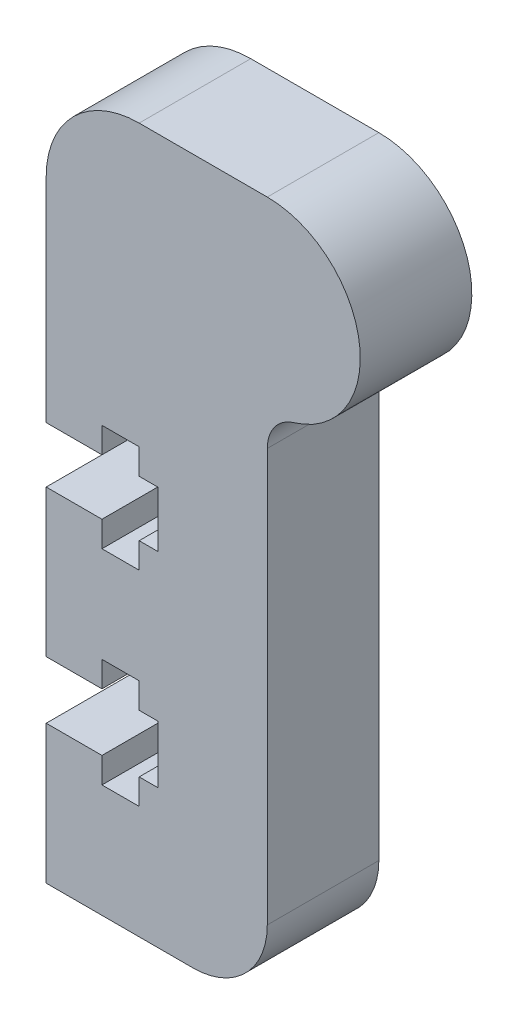
ISO-10303-21;
HEADER;
FILE_DESCRIPTION(('STEP AP214'),'2;1');
FILE_NAME('part.step','',(''),(''),'','','');
FILE_SCHEMA(('AUTOMOTIVE_DESIGN { 1 0 10303 214 1 1 1 1 }'));
ENDSEC;
DATA;
#1=APPLICATION_CONTEXT('core data for automotive mechanical design processes');
#2=APPLICATION_PROTOCOL_DEFINITION('international standard','automotive_design',2000,#1);
#3=PRODUCT_CONTEXT('',#1,'mechanical');
#4=PRODUCT('Part','Part','',(#3));
#5=PRODUCT_RELATED_PRODUCT_CATEGORY('part','',(#4));
#6=PRODUCT_DEFINITION_FORMATION('','',#4);
#7=PRODUCT_DEFINITION_CONTEXT('part definition',#1,'design');
#8=PRODUCT_DEFINITION('design','',#6,#7);
#9=PRODUCT_DEFINITION_SHAPE('','',#8);
#10=(LENGTH_UNIT() NAMED_UNIT(*) SI_UNIT(.MILLI.,.METRE.));
#11=(NAMED_UNIT(*) PLANE_ANGLE_UNIT() SI_UNIT($,.RADIAN.));
#12=(NAMED_UNIT(*) SI_UNIT($,.STERADIAN.) SOLID_ANGLE_UNIT());
#13=UNCERTAINTY_MEASURE_WITH_UNIT(LENGTH_MEASURE(1.E-05),#10,'distance_accuracy_value','');
#14=(GEOMETRIC_REPRESENTATION_CONTEXT(3) GLOBAL_UNCERTAINTY_ASSIGNED_CONTEXT((#13)) GLOBAL_UNIT_ASSIGNED_CONTEXT((#10,
#11,#12)) REPRESENTATION_CONTEXT('',''));
#15=CARTESIAN_POINT('',(0.,0.,0.));
#16=DIRECTION('',(0.,0.,1.));
#17=DIRECTION('',(1.,0.,0.));
#18=AXIS2_PLACEMENT_3D('',#15,#16,#17);
#19=CARTESIAN_POINT('',(5.00000000000291,61.8720955981045,-6.));
#20=DIRECTION('',(0.,1.,0.));
#21=DIRECTION('',(0.,0.,1.));
#22=AXIS2_PLACEMENT_3D('',#19,#20,#21);
#23=PLANE('',#22);
#24=DIRECTION('',(-1.,0.,0.));
#25=VECTOR('',#24,1.);
#26=CARTESIAN_POINT('',(5.00000000000291,61.8720955981045,0.));
#27=LINE('',#26,#25);
#28=CARTESIAN_POINT('',(5.00000000000291,61.8720955981045,0.));
#29=VERTEX_POINT('',#28);
#30=CARTESIAN_POINT('',(3.00000000000291,61.8720955981045,0.));
#31=VERTEX_POINT('',#30);
#32=EDGE_CURVE('E276',#29,#31,#27,.T.);
#33=ORIENTED_EDGE('',*,*,#32,.F.);
#34=DIRECTION('',(0.,0.,1.));
#35=VECTOR('',#34,1.);
#36=CARTESIAN_POINT('',(5.00000000000291,61.8720955981045,-6.));
#37=LINE('',#36,#35);
#38=CARTESIAN_POINT('',(5.00000000000291,61.8720955981045,-6.));
#39=VERTEX_POINT('',#38);
#40=EDGE_CURVE('E11',#39,#29,#37,.T.);
#41=ORIENTED_EDGE('',*,*,#40,.F.);
#42=DIRECTION('',(-1.,0.,0.));
#43=VECTOR('',#42,1.);
#44=CARTESIAN_POINT('',(5.00000000000291,61.8720955981045,-6.));
#45=LINE('',#44,#43);
#46=CARTESIAN_POINT('',(3.00000000000291,61.8720955981045,-6.));
#47=VERTEX_POINT('',#46);
#48=EDGE_CURVE('E368',#39,#47,#45,.T.);
#49=ORIENTED_EDGE('',*,*,#48,.T.);
#50=DIRECTION('',(0.,0.,1.));
#51=VECTOR('',#50,1.);
#52=CARTESIAN_POINT('',(3.00000000000291,61.8720955981045,-6.));
#53=LINE('',#52,#51);
#54=EDGE_CURVE('E38',#47,#31,#53,.T.);
#55=ORIENTED_EDGE('',*,*,#54,.T.);
#56=EDGE_LOOP('',(#33,#41,#49,#55));
#57=FACE_BOUND('',#56,.T.);
#58=ADVANCED_FACE('F35',(#57),#23,.T.);
#59=CARTESIAN_POINT('',(5.00000000000291,63.2470955981045,-6.));
#60=DIRECTION('',(-1.,0.,0.));
#61=DIRECTION('',(0.,0.,1.));
#62=AXIS2_PLACEMENT_3D('',#59,#60,#61);
#63=PLANE('',#62);
#64=DIRECTION('',(0.,-1.,0.));
#65=VECTOR('',#64,1.);
#66=CARTESIAN_POINT('',(5.00000000000291,63.2470955981045,0.));
#67=LINE('',#66,#65);
#68=CARTESIAN_POINT('',(5.00000000000291,63.2470955981045,0.));
#69=VERTEX_POINT('',#68);
#70=EDGE_CURVE('E366',#69,#29,#67,.T.);
#71=ORIENTED_EDGE('',*,*,#70,.F.);
#72=DIRECTION('',(0.,0.,1.));
#73=VECTOR('',#72,1.);
#74=CARTESIAN_POINT('',(5.00000000000291,63.2470955981045,-6.));
#75=LINE('',#74,#73);
#76=CARTESIAN_POINT('',(5.00000000000291,63.2470955981045,-6.));
#77=VERTEX_POINT('',#76);
#78=EDGE_CURVE('E44',#77,#69,#75,.T.);
#79=ORIENTED_EDGE('',*,*,#78,.F.);
#80=DIRECTION('',(0.,-1.,0.));
#81=VECTOR('',#80,1.);
#82=CARTESIAN_POINT('',(5.00000000000291,63.2470955981045,-6.));
#83=LINE('',#82,#81);
#84=EDGE_CURVE('E266',#77,#39,#83,.T.);
#85=ORIENTED_EDGE('',*,*,#84,.T.);
#86=ORIENTED_EDGE('',*,*,#40,.T.);
#87=EDGE_LOOP('',(#71,#79,#85,#86));
#88=FACE_BOUND('',#87,.T.);
#89=ADVANCED_FACE('F428',(#88),#63,.T.);
#90=CARTESIAN_POINT('',(6.00000000000291,63.2470955981045,-6.));
#91=DIRECTION('',(0.,1.,0.));
#92=DIRECTION('',(0.,0.,1.));
#93=AXIS2_PLACEMENT_3D('',#90,#91,#92);
#94=PLANE('',#93);
#95=DIRECTION('',(-1.,0.,0.));
#96=VECTOR('',#95,1.);
#97=CARTESIAN_POINT('',(6.00000000000291,63.2470955981045,0.));
#98=LINE('',#97,#96);
#99=CARTESIAN_POINT('',(6.00000000000291,63.2470955981045,0.));
#100=VERTEX_POINT('',#99);
#101=EDGE_CURVE('E253',#100,#69,#98,.T.);
#102=ORIENTED_EDGE('',*,*,#101,.F.);
#103=DIRECTION('',(0.,0.,1.));
#104=VECTOR('',#103,1.);
#105=CARTESIAN_POINT('',(6.00000000000291,63.2470955981045,-6.));
#106=LINE('',#105,#104);
#107=CARTESIAN_POINT('',(6.00000000000291,63.2470955981045,-6.));
#108=VERTEX_POINT('',#107);
#109=EDGE_CURVE('E248',#108,#100,#106,.T.);
#110=ORIENTED_EDGE('',*,*,#109,.F.);
#111=DIRECTION('',(-1.,0.,0.));
#112=VECTOR('',#111,1.);
#113=CARTESIAN_POINT('',(6.00000000000291,63.2470955981045,-6.));
#114=LINE('',#113,#112);
#115=EDGE_CURVE('E251',#108,#77,#114,.T.);
#116=ORIENTED_EDGE('',*,*,#115,.T.);
#117=ORIENTED_EDGE('',*,*,#78,.T.);
#118=EDGE_LOOP('',(#102,#110,#116,#117));
#119=FACE_BOUND('',#118,.T.);
#120=ADVANCED_FACE('F250',(#119),#94,.T.);
#121=CARTESIAN_POINT('',(6.00000000000291,66.3470955981045,-6.));
#122=DIRECTION('',(-1.,0.,0.));
#123=DIRECTION('',(0.,-1.,0.));
#124=AXIS2_PLACEMENT_3D('',#121,#122,#123);
#125=PLANE('',#124);
#126=DIRECTION('',(0.,-1.,0.));
#127=VECTOR('',#126,1.);
#128=CARTESIAN_POINT('',(6.00000000000291,66.3470955981045,0.));
#129=LINE('',#128,#127);
#130=CARTESIAN_POINT('',(6.00000000000291,66.3470955981045,0.));
#131=VERTEX_POINT('',#130);
#132=EDGE_CURVE('E363',#131,#100,#129,.T.);
#133=ORIENTED_EDGE('',*,*,#132,.F.);
#134=DIRECTION('',(0.,0.,1.));
#135=VECTOR('',#134,1.);
#136=CARTESIAN_POINT('',(6.00000000000291,66.3470955981045,-6.));
#137=LINE('',#136,#135);
#138=CARTESIAN_POINT('',(6.00000000000291,66.3470955981045,-6.));
#139=VERTEX_POINT('',#138);
#140=EDGE_CURVE('E258',#139,#131,#137,.T.);
#141=ORIENTED_EDGE('',*,*,#140,.F.);
#142=DIRECTION('',(0.,-1.,0.));
#143=VECTOR('',#142,1.);
#144=CARTESIAN_POINT('',(6.00000000000291,66.3470955981045,-6.));
#145=LINE('',#144,#143);
#146=EDGE_CURVE('E264',#139,#108,#145,.T.);
#147=ORIENTED_EDGE('',*,*,#146,.T.);
#148=ORIENTED_EDGE('',*,*,#109,.T.);
#149=EDGE_LOOP('',(#133,#141,#147,#148));
#150=FACE_BOUND('',#149,.T.);
#151=ADVANCED_FACE('F268',(#150),#125,.T.);
#152=CARTESIAN_POINT('',(5.00000000000291,66.3470955981045,-6.));
#153=DIRECTION('',(0.,-1.,0.));
#154=DIRECTION('',(0.,0.,-1.));
#155=AXIS2_PLACEMENT_3D('',#152,#153,#154);
#156=PLANE('',#155);
#157=DIRECTION('',(1.,0.,0.));
#158=VECTOR('',#157,1.);
#159=CARTESIAN_POINT('',(5.00000000000291,66.3470955981045,0.));
#160=LINE('',#159,#158);
#161=CARTESIAN_POINT('',(5.00000000000291,66.3470955981045,0.));
#162=VERTEX_POINT('',#161);
#163=EDGE_CURVE('E360',#162,#131,#160,.T.);
#164=ORIENTED_EDGE('',*,*,#163,.F.);
#165=DIRECTION('',(0.,0.,1.));
#166=VECTOR('',#165,1.);
#167=CARTESIAN_POINT('',(5.00000000000291,66.3470955981045,-6.));
#168=LINE('',#167,#166);
#169=CARTESIAN_POINT('',(5.00000000000291,66.3470955981045,-6.));
#170=VERTEX_POINT('',#169);
#171=EDGE_CURVE('E372',#170,#162,#168,.T.);
#172=ORIENTED_EDGE('',*,*,#171,.F.);
#173=DIRECTION('',(1.,0.,0.));
#174=VECTOR('',#173,1.);
#175=CARTESIAN_POINT('',(5.00000000000291,66.3470955981045,-6.));
#176=LINE('',#175,#174);
#177=EDGE_CURVE('E269',#170,#139,#176,.T.);
#178=ORIENTED_EDGE('',*,*,#177,.T.);
#179=ORIENTED_EDGE('',*,*,#140,.T.);
#180=EDGE_LOOP('',(#164,#172,#178,#179));
#181=FACE_BOUND('',#180,.T.);
#182=ADVANCED_FACE('F441',(#181),#156,.T.);
#183=CARTESIAN_POINT('',(5.00000000000291,67.7220955981045,-6.));
#184=DIRECTION('',(-1.,0.,0.));
#185=DIRECTION('',(0.,-1.,0.));
#186=AXIS2_PLACEMENT_3D('',#183,#184,#185);
#187=PLANE('',#186);
#188=DIRECTION('',(0.,-1.,0.));
#189=VECTOR('',#188,1.);
#190=CARTESIAN_POINT('',(5.00000000000291,67.7220955981045,0.));
#191=LINE('',#190,#189);
#192=CARTESIAN_POINT('',(5.00000000000291,67.7220955981045,0.));
#193=VERTEX_POINT('',#192);
#194=EDGE_CURVE('E357',#193,#162,#191,.T.);
#195=ORIENTED_EDGE('',*,*,#194,.F.);
#196=DIRECTION('',(0.,0.,1.));
#197=VECTOR('',#196,1.);
#198=CARTESIAN_POINT('',(5.00000000000291,67.7220955981045,-6.));
#199=LINE('',#198,#197);
#200=CARTESIAN_POINT('',(5.00000000000291,67.7220955981045,-6.));
#201=VERTEX_POINT('',#200);
#202=EDGE_CURVE('E374',#201,#193,#199,.T.);
#203=ORIENTED_EDGE('',*,*,#202,.F.);
#204=DIRECTION('',(0.,-1.,0.));
#205=VECTOR('',#204,1.);
#206=CARTESIAN_POINT('',(5.00000000000291,67.7220955981045,-6.));
#207=LINE('',#206,#205);
#208=EDGE_CURVE('E271',#201,#170,#207,.T.);
#209=ORIENTED_EDGE('',*,*,#208,.T.);
#210=ORIENTED_EDGE('',*,*,#171,.T.);
#211=EDGE_LOOP('',(#195,#203,#209,#210));
#212=FACE_BOUND('',#211,.T.);
#213=ADVANCED_FACE('F444',(#212),#187,.T.);
#214=CARTESIAN_POINT('',(3.00000000000291,67.7220955981045,-6.));
#215=DIRECTION('',(0.,-1.,0.));
#216=DIRECTION('',(0.,0.,-1.));
#217=AXIS2_PLACEMENT_3D('',#214,#215,#216);
#218=PLANE('',#217);
#219=DIRECTION('',(1.,0.,0.));
#220=VECTOR('',#219,1.);
#221=CARTESIAN_POINT('',(3.00000000000291,67.7220955981045,0.));
#222=LINE('',#221,#220);
#223=CARTESIAN_POINT('',(3.00000000000291,67.7220955981045,0.));
#224=VERTEX_POINT('',#223);
#225=EDGE_CURVE('E354',#224,#193,#222,.T.);
#226=ORIENTED_EDGE('',*,*,#225,.F.);
#227=DIRECTION('',(0.,0.,1.));
#228=VECTOR('',#227,1.);
#229=CARTESIAN_POINT('',(3.00000000000291,67.7220955981045,-6.));
#230=LINE('',#229,#228);
#231=CARTESIAN_POINT('',(3.00000000000291,67.7220955981045,-6.));
#232=VERTEX_POINT('',#231);
#233=EDGE_CURVE('E376',#232,#224,#230,.T.);
#234=ORIENTED_EDGE('',*,*,#233,.F.);
#235=DIRECTION('',(1.,0.,0.));
#236=VECTOR('',#235,1.);
#237=CARTESIAN_POINT('',(3.00000000000291,67.7220955981045,-6.));
#238=LINE('',#237,#236);
#239=EDGE_CURVE('E847',#232,#201,#238,.T.);
#240=ORIENTED_EDGE('',*,*,#239,.T.);
#241=ORIENTED_EDGE('',*,*,#202,.T.);
#242=EDGE_LOOP('',(#226,#234,#240,#241));
#243=FACE_BOUND('',#242,.T.);
#244=ADVANCED_FACE('F448',(#243),#218,.T.);
#245=CARTESIAN_POINT('',(3.00000000000291,66.3470955981045,-6.));
#246=DIRECTION('',(1.,0.,0.));
#247=DIRECTION('',(0.,1.,0.));
#248=AXIS2_PLACEMENT_3D('',#245,#246,#247);
#249=PLANE('',#248);
#250=DIRECTION('',(0.,1.,0.));
#251=VECTOR('',#250,1.);
#252=CARTESIAN_POINT('',(3.00000000000291,66.3470955981045,0.));
#253=LINE('',#252,#251);
#254=CARTESIAN_POINT('',(3.00000000000291,66.3470955981045,0.));
#255=VERTEX_POINT('',#254);
#256=EDGE_CURVE('E351',#255,#224,#253,.T.);
#257=ORIENTED_EDGE('',*,*,#256,.F.);
#258=DIRECTION('',(0.,0.,1.));
#259=VECTOR('',#258,1.);
#260=CARTESIAN_POINT('',(3.00000000000291,66.3470955981045,-6.));
#261=LINE('',#260,#259);
#262=CARTESIAN_POINT('',(3.00000000000291,66.3470955981045,-6.));
#263=VERTEX_POINT('',#262);
#264=EDGE_CURVE('E378',#263,#255,#261,.T.);
#265=ORIENTED_EDGE('',*,*,#264,.F.);
#266=DIRECTION('',(0.,1.,0.));
#267=VECTOR('',#266,1.);
#268=CARTESIAN_POINT('',(3.00000000000291,66.3470955981045,-6.));
#269=LINE('',#268,#267);
#270=EDGE_CURVE('E840',#263,#232,#269,.T.);
#271=ORIENTED_EDGE('',*,*,#270,.T.);
#272=ORIENTED_EDGE('',*,*,#233,.T.);
#273=EDGE_LOOP('',(#257,#265,#271,#272));
#274=FACE_BOUND('',#273,.T.);
#275=ADVANCED_FACE('F452',(#274),#249,.T.);
#276=CARTESIAN_POINT('',(2.9108938047519E-12,66.3470955981045,-6.));
#277=DIRECTION('',(0.,-1.,0.));
#278=DIRECTION('',(0.,0.,-1.));
#279=AXIS2_PLACEMENT_3D('',#276,#277,#278);
#280=PLANE('',#279);
#281=DIRECTION('',(1.,0.,0.));
#282=VECTOR('',#281,1.);
#283=CARTESIAN_POINT('',(2.9108938047519E-12,66.3470955981045,0.));
#284=LINE('',#283,#282);
#285=CARTESIAN_POINT('',(2.9108938047519E-12,66.3470955981045,0.));
#286=VERTEX_POINT('',#285);
#287=EDGE_CURVE('E348',#286,#255,#284,.T.);
#288=ORIENTED_EDGE('',*,*,#287,.F.);
#289=DIRECTION('',(0.,0.,1.));
#290=VECTOR('',#289,1.);
#291=CARTESIAN_POINT('',(2.9108938047519E-12,66.3470955981045,-6.));
#292=LINE('',#291,#290);
#293=CARTESIAN_POINT('',(2.9108938047519E-12,66.3470955981045,-6.));
#294=VERTEX_POINT('',#293);
#295=EDGE_CURVE('E380',#294,#286,#292,.T.);
#296=ORIENTED_EDGE('',*,*,#295,.F.);
#297=DIRECTION('',(1.,0.,0.));
#298=VECTOR('',#297,1.);
#299=CARTESIAN_POINT('',(2.9108938047519E-12,66.3470955981045,-6.));
#300=LINE('',#299,#298);
#301=EDGE_CURVE('E836',#294,#263,#300,.T.);
#302=ORIENTED_EDGE('',*,*,#301,.T.);
#303=ORIENTED_EDGE('',*,*,#264,.T.);
#304=EDGE_LOOP('',(#288,#296,#302,#303));
#305=FACE_BOUND('',#304,.T.);
#306=ADVANCED_FACE('F456',(#305),#280,.T.);
#307=CARTESIAN_POINT('',(2.90799139183792E-12,74.2470955981045,-6.));
#308=DIRECTION('',(-1.,0.,0.));
#309=DIRECTION('',(0.,-1.,0.));
#310=AXIS2_PLACEMENT_3D('',#307,#308,#309);
#311=PLANE('',#310);
#312=DIRECTION('',(0.,-1.,0.));
#313=VECTOR('',#312,1.);
#314=CARTESIAN_POINT('',(2.90799139183792E-12,74.2470955981045,0.));
#315=LINE('',#314,#313);
#316=CARTESIAN_POINT('',(2.90799139183792E-12,74.2470955981045,0.));
#317=VERTEX_POINT('',#316);
#318=EDGE_CURVE('E345',#317,#286,#315,.T.);
#319=ORIENTED_EDGE('',*,*,#318,.F.);
#320=DIRECTION('',(0.,0.,1.));
#321=VECTOR('',#320,1.);
#322=CARTESIAN_POINT('',(2.90799139183792E-12,74.2470955981045,-6.));
#323=LINE('',#322,#321);
#324=CARTESIAN_POINT('',(2.90799139183792E-12,74.2470955981045,-6.));
#325=VERTEX_POINT('',#324);
#326=EDGE_CURVE('E382',#325,#317,#323,.T.);
#327=ORIENTED_EDGE('',*,*,#326,.F.);
#328=DIRECTION('',(0.,-1.,0.));
#329=VECTOR('',#328,1.);
#330=CARTESIAN_POINT('',(2.90799139183792E-12,74.2470955981045,-6.));
#331=LINE('',#330,#329);
#332=EDGE_CURVE('E852',#325,#294,#331,.T.);
#333=ORIENTED_EDGE('',*,*,#332,.T.);
#334=ORIENTED_EDGE('',*,*,#295,.T.);
#335=EDGE_LOOP('',(#319,#327,#333,#334));
#336=FACE_BOUND('',#335,.T.);
#337=ADVANCED_FACE('F460',(#336),#311,.T.);
#338=CARTESIAN_POINT('',(3.00000000000122,74.2470955981045,-6.));
#339=DIRECTION('',(0.,1.,0.));
#340=DIRECTION('',(0.,0.,1.));
#341=AXIS2_PLACEMENT_3D('',#338,#339,#340);
#342=PLANE('',#341);
#343=DIRECTION('',(-1.,0.,0.));
#344=VECTOR('',#343,1.);
#345=CARTESIAN_POINT('',(3.00000000000122,74.2470955981045,0.));
#346=LINE('',#345,#344);
#347=CARTESIAN_POINT('',(3.00000000000122,74.2470955981045,0.));
#348=VERTEX_POINT('',#347);
#349=EDGE_CURVE('E342',#348,#317,#346,.T.);
#350=ORIENTED_EDGE('',*,*,#349,.F.);
#351=DIRECTION('',(0.,0.,1.));
#352=VECTOR('',#351,1.);
#353=CARTESIAN_POINT('',(3.00000000000122,74.2470955981045,-6.));
#354=LINE('',#353,#352);
#355=CARTESIAN_POINT('',(3.00000000000122,74.2470955981045,-6.));
#356=VERTEX_POINT('',#355);
#357=EDGE_CURVE('E384',#356,#348,#354,.T.);
#358=ORIENTED_EDGE('',*,*,#357,.F.);
#359=DIRECTION('',(-1.,0.,0.));
#360=VECTOR('',#359,1.);
#361=CARTESIAN_POINT('',(3.00000000000122,74.2470955981045,-6.));
#362=LINE('',#361,#360);
#363=EDGE_CURVE('E829',#356,#325,#362,.T.);
#364=ORIENTED_EDGE('',*,*,#363,.T.);
#365=ORIENTED_EDGE('',*,*,#326,.T.);
#366=EDGE_LOOP('',(#350,#358,#364,#365));
#367=FACE_BOUND('',#366,.T.);
#368=ADVANCED_FACE('F464',(#367),#342,.T.);
#369=CARTESIAN_POINT('',(3.00000000000122,72.8720955981045,-6.));
#370=DIRECTION('',(1.,0.,0.));
#371=DIRECTION('',(0.,1.,0.));
#372=AXIS2_PLACEMENT_3D('',#369,#370,#371);
#373=PLANE('',#372);
#374=DIRECTION('',(0.,1.,0.));
#375=VECTOR('',#374,1.);
#376=CARTESIAN_POINT('',(3.00000000000122,72.8720955981045,0.));
#377=LINE('',#376,#375);
#378=CARTESIAN_POINT('',(3.00000000000122,72.8720955981045,0.));
#379=VERTEX_POINT('',#378);
#380=EDGE_CURVE('E339',#379,#348,#377,.T.);
#381=ORIENTED_EDGE('',*,*,#380,.F.);
#382=DIRECTION('',(0.,0.,1.));
#383=VECTOR('',#382,1.);
#384=CARTESIAN_POINT('',(3.00000000000122,72.8720955981045,-6.));
#385=LINE('',#384,#383);
#386=CARTESIAN_POINT('',(3.00000000000122,72.8720955981045,-6.));
#387=VERTEX_POINT('',#386);
#388=EDGE_CURVE('E386',#387,#379,#385,.T.);
#389=ORIENTED_EDGE('',*,*,#388,.F.);
#390=DIRECTION('',(0.,1.,0.));
#391=VECTOR('',#390,1.);
#392=CARTESIAN_POINT('',(3.00000000000122,72.8720955981045,-6.));
#393=LINE('',#392,#391);
#394=EDGE_CURVE('E825',#387,#356,#393,.T.);
#395=ORIENTED_EDGE('',*,*,#394,.T.);
#396=ORIENTED_EDGE('',*,*,#357,.T.);
#397=EDGE_LOOP('',(#381,#389,#395,#396));
#398=FACE_BOUND('',#397,.T.);
#399=ADVANCED_FACE('F468',(#398),#373,.T.);
#400=CARTESIAN_POINT('',(5.00000000000122,72.8720955981045,-6.));
#401=DIRECTION('',(0.,1.,0.));
#402=DIRECTION('',(0.,0.,1.));
#403=AXIS2_PLACEMENT_3D('',#400,#401,#402);
#404=PLANE('',#403);
#405=DIRECTION('',(-1.,0.,0.));
#406=VECTOR('',#405,1.);
#407=CARTESIAN_POINT('',(5.00000000000122,72.8720955981045,0.));
#408=LINE('',#407,#406);
#409=CARTESIAN_POINT('',(5.00000000000122,72.8720955981045,0.));
#410=VERTEX_POINT('',#409);
#411=EDGE_CURVE('E336',#410,#379,#408,.T.);
#412=ORIENTED_EDGE('',*,*,#411,.F.);
#413=DIRECTION('',(0.,0.,1.));
#414=VECTOR('',#413,1.);
#415=CARTESIAN_POINT('',(5.00000000000122,72.8720955981045,-6.));
#416=LINE('',#415,#414);
#417=CARTESIAN_POINT('',(5.00000000000122,72.8720955981045,-6.));
#418=VERTEX_POINT('',#417);
#419=EDGE_CURVE('E388',#418,#410,#416,.T.);
#420=ORIENTED_EDGE('',*,*,#419,.F.);
#421=DIRECTION('',(-1.,0.,0.));
#422=VECTOR('',#421,1.);
#423=CARTESIAN_POINT('',(5.00000000000122,72.8720955981045,-6.));
#424=LINE('',#423,#422);
#425=EDGE_CURVE('E856',#418,#387,#424,.T.);
#426=ORIENTED_EDGE('',*,*,#425,.T.);
#427=ORIENTED_EDGE('',*,*,#388,.T.);
#428=EDGE_LOOP('',(#412,#420,#426,#427));
#429=FACE_BOUND('',#428,.T.);
#430=ADVANCED_FACE('F472',(#429),#404,.T.);
#431=CARTESIAN_POINT('',(5.00000000000122,74.2470955981045,-6.));
#432=DIRECTION('',(-1.,0.,0.));
#433=DIRECTION('',(0.,0.,1.));
#434=AXIS2_PLACEMENT_3D('',#431,#432,#433);
#435=PLANE('',#434);
#436=DIRECTION('',(0.,-1.,0.));
#437=VECTOR('',#436,1.);
#438=CARTESIAN_POINT('',(5.00000000000122,74.2470955981045,0.));
#439=LINE('',#438,#437);
#440=CARTESIAN_POINT('',(5.00000000000122,74.2470955981045,0.));
#441=VERTEX_POINT('',#440);
#442=EDGE_CURVE('E333',#441,#410,#439,.T.);
#443=ORIENTED_EDGE('',*,*,#442,.F.);
#444=DIRECTION('',(0.,0.,1.));
#445=VECTOR('',#444,1.);
#446=CARTESIAN_POINT('',(5.00000000000122,74.2470955981045,-6.));
#447=LINE('',#446,#445);
#448=CARTESIAN_POINT('',(5.00000000000122,74.2470955981045,-6.));
#449=VERTEX_POINT('',#448);
#450=EDGE_CURVE('E390',#449,#441,#447,.T.);
#451=ORIENTED_EDGE('',*,*,#450,.F.);
#452=DIRECTION('',(0.,-1.,0.));
#453=VECTOR('',#452,1.);
#454=CARTESIAN_POINT('',(5.00000000000122,74.2470955981045,-6.));
#455=LINE('',#454,#453);
#456=EDGE_CURVE('E818',#449,#418,#455,.T.);
#457=ORIENTED_EDGE('',*,*,#456,.T.);
#458=ORIENTED_EDGE('',*,*,#419,.T.);
#459=EDGE_LOOP('',(#443,#451,#457,#458));
#460=FACE_BOUND('',#459,.T.);
#461=ADVANCED_FACE('F476',(#460),#435,.T.);
#462=CARTESIAN_POINT('',(6.00000000000122,74.2470955981045,-6.));
#463=DIRECTION('',(0.,1.,0.));
#464=DIRECTION('',(0.,0.,1.));
#465=AXIS2_PLACEMENT_3D('',#462,#463,#464);
#466=PLANE('',#465);
#467=DIRECTION('',(-1.,0.,0.));
#468=VECTOR('',#467,1.);
#469=CARTESIAN_POINT('',(6.00000000000122,74.2470955981045,0.));
#470=LINE('',#469,#468);
#471=CARTESIAN_POINT('',(6.00000000000122,74.2470955981045,0.));
#472=VERTEX_POINT('',#471);
#473=EDGE_CURVE('E330',#472,#441,#470,.T.);
#474=ORIENTED_EDGE('',*,*,#473,.F.);
#475=DIRECTION('',(0.,0.,1.));
#476=VECTOR('',#475,1.);
#477=CARTESIAN_POINT('',(6.00000000000122,74.2470955981045,-6.));
#478=LINE('',#477,#476);
#479=CARTESIAN_POINT('',(6.00000000000122,74.2470955981045,-6.));
#480=VERTEX_POINT('',#479);
#481=EDGE_CURVE('E392',#480,#472,#478,.T.);
#482=ORIENTED_EDGE('',*,*,#481,.F.);
#483=DIRECTION('',(-1.,0.,0.));
#484=VECTOR('',#483,1.);
#485=CARTESIAN_POINT('',(6.00000000000122,74.2470955981045,-6.));
#486=LINE('',#485,#484);
#487=EDGE_CURVE('E814',#480,#449,#486,.T.);
#488=ORIENTED_EDGE('',*,*,#487,.T.);
#489=ORIENTED_EDGE('',*,*,#450,.T.);
#490=EDGE_LOOP('',(#474,#482,#488,#489));
#491=FACE_BOUND('',#490,.T.);
#492=ADVANCED_FACE('F480',(#491),#466,.T.);
#493=CARTESIAN_POINT('',(6.00000000000121,77.2454923882621,-6.));
#494=DIRECTION('',(-1.,0.,0.));
#495=DIRECTION('',(0.,-1.,0.));
#496=AXIS2_PLACEMENT_3D('',#493,#494,#495);
#497=PLANE('',#496);
#498=DIRECTION('',(0.,-1.,0.));
#499=VECTOR('',#498,1.);
#500=CARTESIAN_POINT('',(6.00000000000121,77.2454923882621,0.));
#501=LINE('',#500,#499);
#502=CARTESIAN_POINT('',(6.00000000000121,77.2454923882621,0.));
#503=VERTEX_POINT('',#502);
#504=EDGE_CURVE('E327',#503,#472,#501,.T.);
#505=ORIENTED_EDGE('',*,*,#504,.F.);
#506=DIRECTION('',(0.,0.,1.));
#507=VECTOR('',#506,1.);
#508=CARTESIAN_POINT('',(6.00000000000121,77.2454923882621,-6.));
#509=LINE('',#508,#507);
#510=CARTESIAN_POINT('',(6.00000000000121,77.2454923882621,-6.));
#511=VERTEX_POINT('',#510);
#512=EDGE_CURVE('E394',#511,#503,#509,.T.);
#513=ORIENTED_EDGE('',*,*,#512,.F.);
#514=DIRECTION('',(0.,-1.,0.));
#515=VECTOR('',#514,1.);
#516=CARTESIAN_POINT('',(6.00000000000121,77.2454923882621,-6.));
#517=LINE('',#516,#515);
#518=EDGE_CURVE('E860',#511,#480,#517,.T.);
#519=ORIENTED_EDGE('',*,*,#518,.T.);
#520=ORIENTED_EDGE('',*,*,#481,.T.);
#521=EDGE_LOOP('',(#505,#513,#519,#520));
#522=FACE_BOUND('',#521,.T.);
#523=ADVANCED_FACE('F484',(#522),#497,.T.);
#524=CARTESIAN_POINT('',(5.00000000000121,77.2454923882621,-6.));
#525=DIRECTION('',(0.,-1.,0.));
#526=DIRECTION('',(0.,0.,-1.));
#527=AXIS2_PLACEMENT_3D('',#524,#525,#526);
#528=PLANE('',#527);
#529=DIRECTION('',(1.,0.,0.));
#530=VECTOR('',#529,1.);
#531=CARTESIAN_POINT('',(5.00000000000121,77.2454923882621,0.));
#532=LINE('',#531,#530);
#533=CARTESIAN_POINT('',(5.00000000000121,77.2454923882621,0.));
#534=VERTEX_POINT('',#533);
#535=EDGE_CURVE('E324',#534,#503,#532,.T.);
#536=ORIENTED_EDGE('',*,*,#535,.F.);
#537=DIRECTION('',(0.,0.,1.));
#538=VECTOR('',#537,1.);
#539=CARTESIAN_POINT('',(5.00000000000121,77.2454923882621,-6.));
#540=LINE('',#539,#538);
#541=CARTESIAN_POINT('',(5.00000000000121,77.2454923882621,-6.));
#542=VERTEX_POINT('',#541);
#543=EDGE_CURVE('E396',#542,#534,#540,.T.);
#544=ORIENTED_EDGE('',*,*,#543,.F.);
#545=DIRECTION('',(1.,0.,0.));
#546=VECTOR('',#545,1.);
#547=CARTESIAN_POINT('',(5.00000000000121,77.2454923882621,-6.));
#548=LINE('',#547,#546);
#549=EDGE_CURVE('E807',#542,#511,#548,.T.);
#550=ORIENTED_EDGE('',*,*,#549,.T.);
#551=ORIENTED_EDGE('',*,*,#512,.T.);
#552=EDGE_LOOP('',(#536,#544,#550,#551));
#553=FACE_BOUND('',#552,.T.);
#554=ADVANCED_FACE('F488',(#553),#528,.T.);
#555=CARTESIAN_POINT('',(5.00000000000121,78.6204923882621,-6.));
#556=DIRECTION('',(-1.,0.,0.));
#557=DIRECTION('',(0.,0.,1.));
#558=AXIS2_PLACEMENT_3D('',#555,#556,#557);
#559=PLANE('',#558);
#560=DIRECTION('',(0.,-1.,0.));
#561=VECTOR('',#560,1.);
#562=CARTESIAN_POINT('',(5.00000000000121,78.6204923882621,0.));
#563=LINE('',#562,#561);
#564=CARTESIAN_POINT('',(5.00000000000121,78.6204923882621,0.));
#565=VERTEX_POINT('',#564);
#566=EDGE_CURVE('E321',#565,#534,#563,.T.);
#567=ORIENTED_EDGE('',*,*,#566,.F.);
#568=DIRECTION('',(0.,0.,1.));
#569=VECTOR('',#568,1.);
#570=CARTESIAN_POINT('',(5.00000000000121,78.6204923882621,-6.));
#571=LINE('',#570,#569);
#572=CARTESIAN_POINT('',(5.00000000000121,78.6204923882621,-6.));
#573=VERTEX_POINT('',#572);
#574=EDGE_CURVE('E398',#573,#565,#571,.T.);
#575=ORIENTED_EDGE('',*,*,#574,.F.);
#576=DIRECTION('',(0.,-1.,0.));
#577=VECTOR('',#576,1.);
#578=CARTESIAN_POINT('',(5.00000000000121,78.6204923882621,-6.));
#579=LINE('',#578,#577);
#580=EDGE_CURVE('E803',#573,#542,#579,.T.);
#581=ORIENTED_EDGE('',*,*,#580,.T.);
#582=ORIENTED_EDGE('',*,*,#543,.T.);
#583=EDGE_LOOP('',(#567,#575,#581,#582));
#584=FACE_BOUND('',#583,.T.);
#585=ADVANCED_FACE('F492',(#584),#559,.T.);
#586=CARTESIAN_POINT('',(3.00000000000121,78.6204923882621,-6.));
#587=DIRECTION('',(0.,-1.,0.));
#588=DIRECTION('',(0.,0.,-1.));
#589=AXIS2_PLACEMENT_3D('',#586,#587,#588);
#590=PLANE('',#589);
#591=DIRECTION('',(1.,0.,0.));
#592=VECTOR('',#591,1.);
#593=CARTESIAN_POINT('',(3.00000000000121,78.6204923882621,0.));
#594=LINE('',#593,#592);
#595=CARTESIAN_POINT('',(3.00000000000121,78.6204923882621,0.));
#596=VERTEX_POINT('',#595);
#597=EDGE_CURVE('E318',#596,#565,#594,.T.);
#598=ORIENTED_EDGE('',*,*,#597,.F.);
#599=DIRECTION('',(0.,0.,1.));
#600=VECTOR('',#599,1.);
#601=CARTESIAN_POINT('',(3.00000000000121,78.6204923882621,-6.));
#602=LINE('',#601,#600);
#603=CARTESIAN_POINT('',(3.00000000000121,78.6204923882621,-6.));
#604=VERTEX_POINT('',#603);
#605=EDGE_CURVE('E400',#604,#596,#602,.T.);
#606=ORIENTED_EDGE('',*,*,#605,.F.);
#607=DIRECTION('',(1.,0.,0.));
#608=VECTOR('',#607,1.);
#609=CARTESIAN_POINT('',(3.00000000000121,78.6204923882621,-6.));
#610=LINE('',#609,#608);
#611=EDGE_CURVE('E864',#604,#573,#610,.T.);
#612=ORIENTED_EDGE('',*,*,#611,.T.);
#613=ORIENTED_EDGE('',*,*,#574,.T.);
#614=EDGE_LOOP('',(#598,#606,#612,#613));
#615=FACE_BOUND('',#614,.T.);
#616=ADVANCED_FACE('F496',(#615),#590,.T.);
#617=CARTESIAN_POINT('',(3.00000000000121,77.2454923882621,-6.));
#618=DIRECTION('',(1.,0.,0.));
#619=DIRECTION('',(0.,0.,-1.));
#620=AXIS2_PLACEMENT_3D('',#617,#618,#619);
#621=PLANE('',#620);
#622=DIRECTION('',(0.,1.,0.));
#623=VECTOR('',#622,1.);
#624=CARTESIAN_POINT('',(3.00000000000121,77.2454923882621,0.));
#625=LINE('',#624,#623);
#626=CARTESIAN_POINT('',(3.00000000000121,77.2454923882621,0.));
#627=VERTEX_POINT('',#626);
#628=EDGE_CURVE('E315',#627,#596,#625,.T.);
#629=ORIENTED_EDGE('',*,*,#628,.F.);
#630=DIRECTION('',(0.,0.,1.));
#631=VECTOR('',#630,1.);
#632=CARTESIAN_POINT('',(3.00000000000121,77.2454923882621,-6.));
#633=LINE('',#632,#631);
#634=CARTESIAN_POINT('',(3.00000000000121,77.2454923882621,-6.));
#635=VERTEX_POINT('',#634);
#636=EDGE_CURVE('E402',#635,#627,#633,.T.);
#637=ORIENTED_EDGE('',*,*,#636,.F.);
#638=DIRECTION('',(0.,1.,0.));
#639=VECTOR('',#638,1.);
#640=CARTESIAN_POINT('',(3.00000000000121,77.2454923882621,-6.));
#641=LINE('',#640,#639);
#642=EDGE_CURVE('E796',#635,#604,#641,.T.);
#643=ORIENTED_EDGE('',*,*,#642,.T.);
#644=ORIENTED_EDGE('',*,*,#605,.T.);
#645=EDGE_LOOP('',(#629,#637,#643,#644));
#646=FACE_BOUND('',#645,.T.);
#647=ADVANCED_FACE('F500',(#646),#621,.T.);
#648=CARTESIAN_POINT('',(0.,77.2454923882621,-6.));
#649=DIRECTION('',(0.,-1.,0.));
#650=DIRECTION('',(0.,0.,-1.));
#651=AXIS2_PLACEMENT_3D('',#648,#649,#650);
#652=PLANE('',#651);
#653=DIRECTION('',(1.,0.,0.));
#654=VECTOR('',#653,1.);
#655=CARTESIAN_POINT('',(0.,77.2454923882621,0.));
#656=LINE('',#655,#654);
#657=CARTESIAN_POINT('',(0.,77.2454923882621,0.));
#658=VERTEX_POINT('',#657);
#659=EDGE_CURVE('E312',#658,#627,#656,.T.);
#660=ORIENTED_EDGE('',*,*,#659,.F.);
#661=DIRECTION('',(0.,0.,1.));
#662=VECTOR('',#661,1.);
#663=CARTESIAN_POINT('',(0.,77.2454923882621,-6.));
#664=LINE('',#663,#662);
#665=CARTESIAN_POINT('',(0.,77.2454923882621,-6.));
#666=VERTEX_POINT('',#665);
#667=EDGE_CURVE('E404',#666,#658,#664,.T.);
#668=ORIENTED_EDGE('',*,*,#667,.F.);
#669=DIRECTION('',(1.,0.,0.));
#670=VECTOR('',#669,1.);
#671=CARTESIAN_POINT('',(0.,77.2454923882621,-6.));
#672=LINE('',#671,#670);
#673=EDGE_CURVE('E792',#666,#635,#672,.T.);
#674=ORIENTED_EDGE('',*,*,#673,.T.);
#675=ORIENTED_EDGE('',*,*,#636,.T.);
#676=EDGE_LOOP('',(#660,#668,#674,#675));
#677=FACE_BOUND('',#676,.T.);
#678=ADVANCED_FACE('F504',(#677),#652,.T.);
#679=CARTESIAN_POINT('',(0.,88.6954923882617,-6.));
#680=DIRECTION('',(-1.,0.,0.));
#681=DIRECTION('',(0.,0.,1.));
#682=AXIS2_PLACEMENT_3D('',#679,#680,#681);
#683=PLANE('',#682);
#684=DIRECTION('',(0.,-1.,0.));
#685=VECTOR('',#684,1.);
#686=CARTESIAN_POINT('',(0.,88.6954923882617,0.));
#687=LINE('',#686,#685);
#688=CARTESIAN_POINT('',(0.,88.6954923882617,0.));
#689=VERTEX_POINT('',#688);
#690=EDGE_CURVE('E309',#689,#658,#687,.T.);
#691=ORIENTED_EDGE('',*,*,#690,.F.);
#692=DIRECTION('',(0.,0.,1.));
#693=VECTOR('',#692,1.);
#694=CARTESIAN_POINT('',(0.,88.6954923882617,-6.));
#695=LINE('',#694,#693);
#696=CARTESIAN_POINT('',(0.,88.6954923882617,-6.));
#697=VERTEX_POINT('',#696);
#698=EDGE_CURVE('E406',#697,#689,#695,.T.);
#699=ORIENTED_EDGE('',*,*,#698,.F.);
#700=DIRECTION('',(0.,-1.,0.));
#701=VECTOR('',#700,1.);
#702=CARTESIAN_POINT('',(0.,88.6954923882617,-6.));
#703=LINE('',#702,#701);
#704=EDGE_CURVE('E868',#697,#666,#703,.T.);
#705=ORIENTED_EDGE('',*,*,#704,.T.);
#706=ORIENTED_EDGE('',*,*,#667,.T.);
#707=EDGE_LOOP('',(#691,#699,#705,#706));
#708=FACE_BOUND('',#707,.T.);
#709=ADVANCED_FACE('F508',(#708),#683,.T.);
#710=CARTESIAN_POINT('',(5.,88.6954923882617,-6.));
#711=DIRECTION('',(0.,0.,1.));
#712=DIRECTION('',(1.,0.,0.));
#713=AXIS2_PLACEMENT_3D('',#710,#711,#712);
#714=CYLINDRICAL_SURFACE('',#713,5.);
#715=CARTESIAN_POINT('',(5.,88.6954923882617,0.));
#716=DIRECTION('',(0.,0.,1.));
#717=DIRECTION('',(1.,0.,0.));
#718=AXIS2_PLACEMENT_3D('',#715,#716,#717);
#719=CIRCLE('',#718,5.);
#720=CARTESIAN_POINT('',(5.00000000000004,93.6954923882617,0.));
#721=VERTEX_POINT('',#720);
#722=EDGE_CURVE('E306',#721,#689,#719,.T.);
#723=ORIENTED_EDGE('',*,*,#722,.F.);
#724=DIRECTION('',(0.,0.,1.));
#725=VECTOR('',#724,1.);
#726=CARTESIAN_POINT('',(5.00000000000004,93.6954923882617,-6.));
#727=LINE('',#726,#725);
#728=CARTESIAN_POINT('',(5.00000000000004,93.6954923882617,-6.));
#729=VERTEX_POINT('',#728);
#730=EDGE_CURVE('E408',#729,#721,#727,.T.);
#731=ORIENTED_EDGE('',*,*,#730,.F.);
#732=CARTESIAN_POINT('',(5.,88.6954923882617,-6.));
#733=DIRECTION('',(0.,0.,1.));
#734=DIRECTION('',(1.,0.,0.));
#735=AXIS2_PLACEMENT_3D('',#732,#733,#734);
#736=CIRCLE('',#735,5.);
#737=EDGE_CURVE('E785',#729,#697,#736,.T.);
#738=ORIENTED_EDGE('',*,*,#737,.T.);
#739=ORIENTED_EDGE('',*,*,#698,.T.);
#740=EDGE_LOOP('',(#723,#731,#738,#739));
#741=FACE_BOUND('',#740,.T.);
#742=ADVANCED_FACE('F512',(#741),#714,.T.);
#743=CARTESIAN_POINT('',(5.00000000000004,93.6954923882617,-6.));
#744=DIRECTION('',(0.,1.,0.));
#745=DIRECTION('',(0.,0.,1.));
#746=AXIS2_PLACEMENT_3D('',#743,#744,#745);
#747=PLANE('',#746);
#748=DIRECTION('',(-1.,0.,0.));
#749=VECTOR('',#748,1.);
#750=CARTESIAN_POINT('',(5.00000000000004,93.6954923882617,0.));
#751=LINE('',#750,#749);
#752=CARTESIAN_POINT('',(11.8893076230229,93.6954923882617,0.));
#753=VERTEX_POINT('',#752);
#754=EDGE_CURVE('E303',#753,#721,#751,.T.);
#755=ORIENTED_EDGE('',*,*,#754,.F.);
#756=DIRECTION('',(0.,0.,1.));
#757=VECTOR('',#756,1.);
#758=CARTESIAN_POINT('',(11.8893076230229,93.6954923882617,-6.));
#759=LINE('',#758,#757);
#760=CARTESIAN_POINT('',(11.8893076230229,93.6954923882617,-6.));
#761=VERTEX_POINT('',#760);
#762=EDGE_CURVE('E410',#761,#753,#759,.T.);
#763=ORIENTED_EDGE('',*,*,#762,.F.);
#764=DIRECTION('',(-1.,0.,0.));
#765=VECTOR('',#764,1.);
#766=CARTESIAN_POINT('',(5.00000000000004,93.6954923882617,-6.));
#767=LINE('',#766,#765);
#768=EDGE_CURVE('E781',#761,#729,#767,.T.);
#769=ORIENTED_EDGE('',*,*,#768,.T.);
#770=ORIENTED_EDGE('',*,*,#730,.T.);
#771=EDGE_LOOP('',(#755,#763,#769,#770));
#772=FACE_BOUND('',#771,.T.);
#773=ADVANCED_FACE('F516',(#772),#747,.T.);
#774=CARTESIAN_POINT('',(11.8893076230229,88.6954923882617,-6.));
#775=DIRECTION('',(0.,0.,1.));
#776=DIRECTION('',(1.,0.,0.));
#777=AXIS2_PLACEMENT_3D('',#774,#775,#776);
#778=CYLINDRICAL_SURFACE('',#777,5.);
#779=CARTESIAN_POINT('',(11.8893076230229,88.6954923882617,0.));
#780=DIRECTION('',(0.,0.,1.));
#781=DIRECTION('',(1.,0.,0.));
#782=AXIS2_PLACEMENT_3D('',#779,#780,#781);
#783=CIRCLE('',#782,5.);
#784=CARTESIAN_POINT('',(13.3178790515943,83.9039181507621,0.));
#785=VERTEX_POINT('',#784);
#786=EDGE_CURVE('E300',#785,#753,#783,.T.);
#787=ORIENTED_EDGE('',*,*,#786,.F.);
#788=DIRECTION('',(0.,0.,1.));
#789=VECTOR('',#788,1.);
#790=CARTESIAN_POINT('',(13.3178790515943,83.9039181507621,-6.));
#791=LINE('',#790,#789);
#792=CARTESIAN_POINT('',(13.3178790515943,83.9039181507621,-6.));
#793=VERTEX_POINT('',#792);
#794=EDGE_CURVE('E412',#793,#785,#791,.T.);
#795=ORIENTED_EDGE('',*,*,#794,.F.);
#796=CARTESIAN_POINT('',(11.8893076230229,88.6954923882617,-6.));
#797=DIRECTION('',(0.,0.,1.));
#798=DIRECTION('',(1.,0.,0.));
#799=AXIS2_PLACEMENT_3D('',#796,#797,#798);
#800=CIRCLE('',#799,5.);
#801=EDGE_CURVE('E872',#793,#761,#800,.T.);
#802=ORIENTED_EDGE('',*,*,#801,.T.);
#803=ORIENTED_EDGE('',*,*,#762,.T.);
#804=EDGE_LOOP('',(#787,#795,#802,#803));
#805=FACE_BOUND('',#804,.T.);
#806=ADVANCED_FACE('F520',(#805),#778,.T.);
#807=CARTESIAN_POINT('',(13.8893076230229,81.9872884557623,-6.));
#808=DIRECTION('',(0.,0.,1.));
#809=DIRECTION('',(1.,0.,0.));
#810=AXIS2_PLACEMENT_3D('',#807,#808,#809);
#811=CYLINDRICAL_SURFACE('',#810,2.);
#812=CARTESIAN_POINT('',(13.8893076230229,81.9872884557623,0.));
#813=DIRECTION('',(0.,0.,-1.));
#814=DIRECTION('',(-1.,0.,0.));
#815=AXIS2_PLACEMENT_3D('',#812,#813,#814);
#816=CIRCLE('',#815,2.);
#817=CARTESIAN_POINT('',(11.8893076230229,81.9872884557623,0.));
#818=VERTEX_POINT('',#817);
#819=EDGE_CURVE('E297',#818,#785,#816,.T.);
#820=ORIENTED_EDGE('',*,*,#819,.F.);
#821=DIRECTION('',(0.,0.,1.));
#822=VECTOR('',#821,1.);
#823=CARTESIAN_POINT('',(11.8893076230229,81.9872884557623,-6.));
#824=LINE('',#823,#822);
#825=CARTESIAN_POINT('',(11.8893076230229,81.9872884557623,-6.));
#826=VERTEX_POINT('',#825);
#827=EDGE_CURVE('E414',#826,#818,#824,.T.);
#828=ORIENTED_EDGE('',*,*,#827,.F.);
#829=CARTESIAN_POINT('',(13.8893076230229,81.9872884557623,-6.));
#830=DIRECTION('',(0.,0.,-1.));
#831=DIRECTION('',(-1.,0.,0.));
#832=AXIS2_PLACEMENT_3D('',#829,#830,#831);
#833=CIRCLE('',#832,2.);
#834=EDGE_CURVE('E774',#826,#793,#833,.T.);
#835=ORIENTED_EDGE('',*,*,#834,.T.);
#836=ORIENTED_EDGE('',*,*,#794,.T.);
#837=EDGE_LOOP('',(#820,#828,#835,#836));
#838=FACE_BOUND('',#837,.T.);
#839=ADVANCED_FACE('F524',(#838),#811,.F.);
#840=CARTESIAN_POINT('',(11.8893076230229,59.7970955981041,-6.));
#841=DIRECTION('',(1.,0.,0.));
#842=DIRECTION('',(0.,1.,0.));
#843=AXIS2_PLACEMENT_3D('',#840,#841,#842);
#844=PLANE('',#843);
#845=DIRECTION('',(0.,1.,0.));
#846=VECTOR('',#845,1.);
#847=CARTESIAN_POINT('',(11.8893076230229,59.7970955981041,0.));
#848=LINE('',#847,#846);
#849=CARTESIAN_POINT('',(11.8893076230229,59.7970955981041,0.));
#850=VERTEX_POINT('',#849);
#851=EDGE_CURVE('E294',#850,#818,#848,.T.);
#852=ORIENTED_EDGE('',*,*,#851,.F.);
#853=DIRECTION('',(0.,0.,1.));
#854=VECTOR('',#853,1.);
#855=CARTESIAN_POINT('',(11.8893076230229,59.7970955981041,-6.));
#856=LINE('',#855,#854);
#857=CARTESIAN_POINT('',(11.8893076230229,59.7970955981041,-6.));
#858=VERTEX_POINT('',#857);
#859=EDGE_CURVE('E416',#858,#850,#856,.T.);
#860=ORIENTED_EDGE('',*,*,#859,.F.);
#861=DIRECTION('',(0.,1.,0.));
#862=VECTOR('',#861,1.);
#863=CARTESIAN_POINT('',(11.8893076230229,59.7970955981041,-6.));
#864=LINE('',#863,#862);
#865=EDGE_CURVE('E770',#858,#826,#864,.T.);
#866=ORIENTED_EDGE('',*,*,#865,.T.);
#867=ORIENTED_EDGE('',*,*,#827,.T.);
#868=EDGE_LOOP('',(#852,#860,#866,#867));
#869=FACE_BOUND('',#868,.T.);
#870=ADVANCED_FACE('F528',(#869),#844,.T.);
#871=CARTESIAN_POINT('',(7.88930762302291,59.7970955981041,-6.));
#872=DIRECTION('',(0.,0.,1.));
#873=DIRECTION('',(1.,0.,0.));
#874=AXIS2_PLACEMENT_3D('',#871,#872,#873);
#875=CYLINDRICAL_SURFACE('',#874,4.);
#876=CARTESIAN_POINT('',(7.88930762302291,59.7970955981041,0.));
#877=DIRECTION('',(0.,0.,1.));
#878=DIRECTION('',(1.,0.,0.));
#879=AXIS2_PLACEMENT_3D('',#876,#877,#878);
#880=CIRCLE('',#879,4.);
#881=CARTESIAN_POINT('',(7.88930762302292,55.7970955981041,0.));
#882=VERTEX_POINT('',#881);
#883=EDGE_CURVE('E291',#882,#850,#880,.T.);
#884=ORIENTED_EDGE('',*,*,#883,.F.);
#885=DIRECTION('',(0.,0.,1.));
#886=VECTOR('',#885,1.);
#887=CARTESIAN_POINT('',(7.88930762302292,55.7970955981041,-6.));
#888=LINE('',#887,#886);
#889=CARTESIAN_POINT('',(7.88930762302292,55.7970955981041,-6.));
#890=VERTEX_POINT('',#889);
#891=EDGE_CURVE('E418',#890,#882,#888,.T.);
#892=ORIENTED_EDGE('',*,*,#891,.F.);
#893=CARTESIAN_POINT('',(7.88930762302291,59.7970955981041,-6.));
#894=DIRECTION('',(0.,0.,1.));
#895=DIRECTION('',(1.,0.,0.));
#896=AXIS2_PLACEMENT_3D('',#893,#894,#895);
#897=CIRCLE('',#896,4.);
#898=EDGE_CURVE('E876',#890,#858,#897,.T.);
#899=ORIENTED_EDGE('',*,*,#898,.T.);
#900=ORIENTED_EDGE('',*,*,#859,.T.);
#901=EDGE_LOOP('',(#884,#892,#899,#900));
#902=FACE_BOUND('',#901,.T.);
#903=ADVANCED_FACE('F532',(#902),#875,.T.);
#904=CARTESIAN_POINT('',(2.91353116476632E-12,55.7970955981041,-6.));
#905=DIRECTION('',(0.,-1.,0.));
#906=DIRECTION('',(0.,0.,-1.));
#907=AXIS2_PLACEMENT_3D('',#904,#905,#906);
#908=PLANE('',#907);
#909=DIRECTION('',(1.,0.,0.));
#910=VECTOR('',#909,1.);
#911=CARTESIAN_POINT('',(2.91353116476632E-12,55.7970955981041,0.));
#912=LINE('',#911,#910);
#913=CARTESIAN_POINT('',(2.91353116476632E-12,55.7970955981041,0.));
#914=VERTEX_POINT('',#913);
#915=EDGE_CURVE('E288',#914,#882,#912,.T.);
#916=ORIENTED_EDGE('',*,*,#915,.F.);
#917=DIRECTION('',(0.,0.,1.));
#918=VECTOR('',#917,1.);
#919=CARTESIAN_POINT('',(2.91353116476632E-12,55.7970955981041,-6.));
#920=LINE('',#919,#918);
#921=CARTESIAN_POINT('',(2.91353116476632E-12,55.7970955981041,-6.));
#922=VERTEX_POINT('',#921);
#923=EDGE_CURVE('E420',#922,#914,#920,.T.);
#924=ORIENTED_EDGE('',*,*,#923,.F.);
#925=DIRECTION('',(1.,0.,0.));
#926=VECTOR('',#925,1.);
#927=CARTESIAN_POINT('',(2.91353116476632E-12,55.7970955981041,-6.));
#928=LINE('',#927,#926);
#929=EDGE_CURVE('E763',#922,#890,#928,.T.);
#930=ORIENTED_EDGE('',*,*,#929,.T.);
#931=ORIENTED_EDGE('',*,*,#891,.T.);
#932=EDGE_LOOP('',(#916,#924,#930,#931));
#933=FACE_BOUND('',#932,.T.);
#934=ADVANCED_FACE('F536',(#933),#908,.T.);
#935=CARTESIAN_POINT('',(2.91079407917023E-12,63.2470955981045,-6.));
#936=DIRECTION('',(-1.,0.,0.));
#937=DIRECTION('',(0.,-1.,0.));
#938=AXIS2_PLACEMENT_3D('',#935,#936,#937);
#939=PLANE('',#938);
#940=DIRECTION('',(0.,-1.,0.));
#941=VECTOR('',#940,1.);
#942=CARTESIAN_POINT('',(2.91079407917023E-12,63.2470955981045,0.));
#943=LINE('',#942,#941);
#944=CARTESIAN_POINT('',(2.91079407917023E-12,63.2470955981045,0.));
#945=VERTEX_POINT('',#944);
#946=EDGE_CURVE('E285',#945,#914,#943,.T.);
#947=ORIENTED_EDGE('',*,*,#946,.F.);
#948=DIRECTION('',(0.,0.,1.));
#949=VECTOR('',#948,1.);
#950=CARTESIAN_POINT('',(2.91079407917023E-12,63.2470955981045,-6.));
#951=LINE('',#950,#949);
#952=CARTESIAN_POINT('',(2.91079407917023E-12,63.2470955981045,-6.));
#953=VERTEX_POINT('',#952);
#954=EDGE_CURVE('E422',#953,#945,#951,.T.);
#955=ORIENTED_EDGE('',*,*,#954,.F.);
#956=DIRECTION('',(0.,-1.,0.));
#957=VECTOR('',#956,1.);
#958=CARTESIAN_POINT('',(2.91079407917023E-12,63.2470955981045,-6.));
#959=LINE('',#958,#957);
#960=EDGE_CURVE('E759',#953,#922,#959,.T.);
#961=ORIENTED_EDGE('',*,*,#960,.T.);
#962=ORIENTED_EDGE('',*,*,#923,.T.);
#963=EDGE_LOOP('',(#947,#955,#961,#962));
#964=FACE_BOUND('',#963,.T.);
#965=ADVANCED_FACE('F540',(#964),#939,.T.);
#966=CARTESIAN_POINT('',(3.00000000000291,63.2470955981045,-6.));
#967=DIRECTION('',(0.,1.,0.));
#968=DIRECTION('',(0.,0.,1.));
#969=AXIS2_PLACEMENT_3D('',#966,#967,#968);
#970=PLANE('',#969);
#971=DIRECTION('',(-1.,0.,0.));
#972=VECTOR('',#971,1.);
#973=CARTESIAN_POINT('',(3.00000000000291,63.2470955981045,0.));
#974=LINE('',#973,#972);
#975=CARTESIAN_POINT('',(3.00000000000291,63.2470955981045,0.));
#976=VERTEX_POINT('',#975);
#977=EDGE_CURVE('E282',#976,#945,#974,.T.);
#978=ORIENTED_EDGE('',*,*,#977,.F.);
#979=DIRECTION('',(0.,0.,1.));
#980=VECTOR('',#979,1.);
#981=CARTESIAN_POINT('',(3.00000000000291,63.2470955981045,-6.));
#982=LINE('',#981,#980);
#983=CARTESIAN_POINT('',(3.00000000000291,63.2470955981045,-6.));
#984=VERTEX_POINT('',#983);
#985=EDGE_CURVE('E423',#984,#976,#982,.T.);
#986=ORIENTED_EDGE('',*,*,#985,.F.);
#987=DIRECTION('',(-1.,0.,0.));
#988=VECTOR('',#987,1.);
#989=CARTESIAN_POINT('',(3.00000000000291,63.2470955981045,-6.));
#990=LINE('',#989,#988);
#991=EDGE_CURVE('E880',#984,#953,#990,.T.);
#992=ORIENTED_EDGE('',*,*,#991,.T.);
#993=ORIENTED_EDGE('',*,*,#954,.T.);
#994=EDGE_LOOP('',(#978,#986,#992,#993));
#995=FACE_BOUND('',#994,.T.);
#996=ADVANCED_FACE('F544',(#995),#970,.T.);
#997=CARTESIAN_POINT('',(3.00000000000291,61.8720955981045,-6.));
#998=DIRECTION('',(1.,0.,0.));
#999=DIRECTION('',(0.,1.,0.));
#1000=AXIS2_PLACEMENT_3D('',#997,#998,#999);
#1001=PLANE('',#1000);
#1002=DIRECTION('',(0.,1.,0.));
#1003=VECTOR('',#1002,1.);
#1004=CARTESIAN_POINT('',(3.00000000000291,61.8720955981045,0.));
#1005=LINE('',#1004,#1003);
#1006=EDGE_CURVE('E279',#31,#976,#1005,.T.);
#1007=ORIENTED_EDGE('',*,*,#1006,.F.);
#1008=ORIENTED_EDGE('',*,*,#54,.F.);
#1009=DIRECTION('',(0.,1.,0.));
#1010=VECTOR('',#1009,1.);
#1011=CARTESIAN_POINT('',(3.00000000000291,61.8720955981045,-6.));
#1012=LINE('',#1011,#1010);
#1013=EDGE_CURVE('E882',#47,#984,#1012,.T.);
#1014=ORIENTED_EDGE('',*,*,#1013,.T.);
#1015=ORIENTED_EDGE('',*,*,#985,.T.);
#1016=EDGE_LOOP('',(#1007,#1008,#1014,#1015));
#1017=FACE_BOUND('',#1016,.T.);
#1018=ADVANCED_FACE('F425',(#1017),#1001,.T.);
#1019=CARTESIAN_POINT('',(7.88930762302291,59.7970955981041,-6.));
#1020=DIRECTION('',(0.,0.,1.));
#1021=DIRECTION('',(1.,0.,0.));
#1022=AXIS2_PLACEMENT_3D('',#1019,#1020,#1021);
#1023=PLANE('',#1022);
#1024=ORIENTED_EDGE('',*,*,#48,.F.);
#1025=ORIENTED_EDGE('',*,*,#84,.F.);
#1026=ORIENTED_EDGE('',*,*,#115,.F.);
#1027=ORIENTED_EDGE('',*,*,#146,.F.);
#1028=ORIENTED_EDGE('',*,*,#177,.F.);
#1029=ORIENTED_EDGE('',*,*,#208,.F.);
#1030=ORIENTED_EDGE('',*,*,#239,.F.);
#1031=ORIENTED_EDGE('',*,*,#270,.F.);
#1032=ORIENTED_EDGE('',*,*,#301,.F.);
#1033=ORIENTED_EDGE('',*,*,#332,.F.);
#1034=ORIENTED_EDGE('',*,*,#363,.F.);
#1035=ORIENTED_EDGE('',*,*,#394,.F.);
#1036=ORIENTED_EDGE('',*,*,#425,.F.);
#1037=ORIENTED_EDGE('',*,*,#456,.F.);
#1038=ORIENTED_EDGE('',*,*,#487,.F.);
#1039=ORIENTED_EDGE('',*,*,#518,.F.);
#1040=ORIENTED_EDGE('',*,*,#549,.F.);
#1041=ORIENTED_EDGE('',*,*,#580,.F.);
#1042=ORIENTED_EDGE('',*,*,#611,.F.);
#1043=ORIENTED_EDGE('',*,*,#642,.F.);
#1044=ORIENTED_EDGE('',*,*,#673,.F.);
#1045=ORIENTED_EDGE('',*,*,#704,.F.);
#1046=ORIENTED_EDGE('',*,*,#737,.F.);
#1047=ORIENTED_EDGE('',*,*,#768,.F.);
#1048=ORIENTED_EDGE('',*,*,#801,.F.);
#1049=ORIENTED_EDGE('',*,*,#834,.F.);
#1050=ORIENTED_EDGE('',*,*,#865,.F.);
#1051=ORIENTED_EDGE('',*,*,#898,.F.);
#1052=ORIENTED_EDGE('',*,*,#929,.F.);
#1053=ORIENTED_EDGE('',*,*,#960,.F.);
#1054=ORIENTED_EDGE('',*,*,#991,.F.);
#1055=ORIENTED_EDGE('',*,*,#1013,.F.);
#1056=EDGE_LOOP('',(#1024,#1025,#1026,#1027,#1028,#1029,#1030,#1031,#1032,#1033,#1034,#1035,
#1036,#1037,#1038,#1039,#1040,#1041,#1042,#1043,#1044,#1045,#1046,#1047,#1048,#1049,#1050,#1051,
#1052,#1053,#1054,#1055));
#1057=FACE_BOUND('',#1056,.T.);
#1058=ADVANCED_FACE('F262',(#1057),#1023,.F.);
#1059=CARTESIAN_POINT('',(7.88930762302291,59.7970955981041,0.));
#1060=DIRECTION('',(0.,0.,1.));
#1061=DIRECTION('',(1.,0.,0.));
#1062=AXIS2_PLACEMENT_3D('',#1059,#1060,#1061);
#1063=PLANE('',#1062);
#1064=ORIENTED_EDGE('',*,*,#32,.T.);
#1065=ORIENTED_EDGE('',*,*,#1006,.T.);
#1066=ORIENTED_EDGE('',*,*,#977,.T.);
#1067=ORIENTED_EDGE('',*,*,#946,.T.);
#1068=ORIENTED_EDGE('',*,*,#915,.T.);
#1069=ORIENTED_EDGE('',*,*,#883,.T.);
#1070=ORIENTED_EDGE('',*,*,#851,.T.);
#1071=ORIENTED_EDGE('',*,*,#819,.T.);
#1072=ORIENTED_EDGE('',*,*,#786,.T.);
#1073=ORIENTED_EDGE('',*,*,#754,.T.);
#1074=ORIENTED_EDGE('',*,*,#722,.T.);
#1075=ORIENTED_EDGE('',*,*,#690,.T.);
#1076=ORIENTED_EDGE('',*,*,#659,.T.);
#1077=ORIENTED_EDGE('',*,*,#628,.T.);
#1078=ORIENTED_EDGE('',*,*,#597,.T.);
#1079=ORIENTED_EDGE('',*,*,#566,.T.);
#1080=ORIENTED_EDGE('',*,*,#535,.T.);
#1081=ORIENTED_EDGE('',*,*,#504,.T.);
#1082=ORIENTED_EDGE('',*,*,#473,.T.);
#1083=ORIENTED_EDGE('',*,*,#442,.T.);
#1084=ORIENTED_EDGE('',*,*,#411,.T.);
#1085=ORIENTED_EDGE('',*,*,#380,.T.);
#1086=ORIENTED_EDGE('',*,*,#349,.T.);
#1087=ORIENTED_EDGE('',*,*,#318,.T.);
#1088=ORIENTED_EDGE('',*,*,#287,.T.);
#1089=ORIENTED_EDGE('',*,*,#256,.T.);
#1090=ORIENTED_EDGE('',*,*,#225,.T.);
#1091=ORIENTED_EDGE('',*,*,#194,.T.);
#1092=ORIENTED_EDGE('',*,*,#163,.T.);
#1093=ORIENTED_EDGE('',*,*,#132,.T.);
#1094=ORIENTED_EDGE('',*,*,#101,.T.);
#1095=ORIENTED_EDGE('',*,*,#70,.T.);
#1096=EDGE_LOOP('',(#1064,#1065,#1066,#1067,#1068,#1069,#1070,#1071,#1072,#1073,#1074,#1075,
#1076,#1077,#1078,#1079,#1080,#1081,#1082,#1083,#1084,#1085,#1086,#1087,#1088,#1089,#1090,#1091,
#1092,#1093,#1094,#1095));
#1097=FACE_BOUND('',#1096,.T.);
#1098=ADVANCED_FACE('F427',(#1097),#1063,.T.);
#1099=CLOSED_SHELL('',(#58,#89,#120,#151,#182,#213,#244,#275,#306,#337,#368,#399,#430,#461,#492,
#523,#554,#585,#616,#647,#678,#709,#742,#773,#806,#839,#870,#903,#934,#965,#996,#1018,#1058,#1098));
#1100=MANIFOLD_SOLID_BREP('B2',#1099);
#1101=ADVANCED_BREP_SHAPE_REPRESENTATION('',(#18,#1100),#14);
#1102=SHAPE_DEFINITION_REPRESENTATION(#9,#1101);
ENDSEC;
END-ISO-10303-21;
